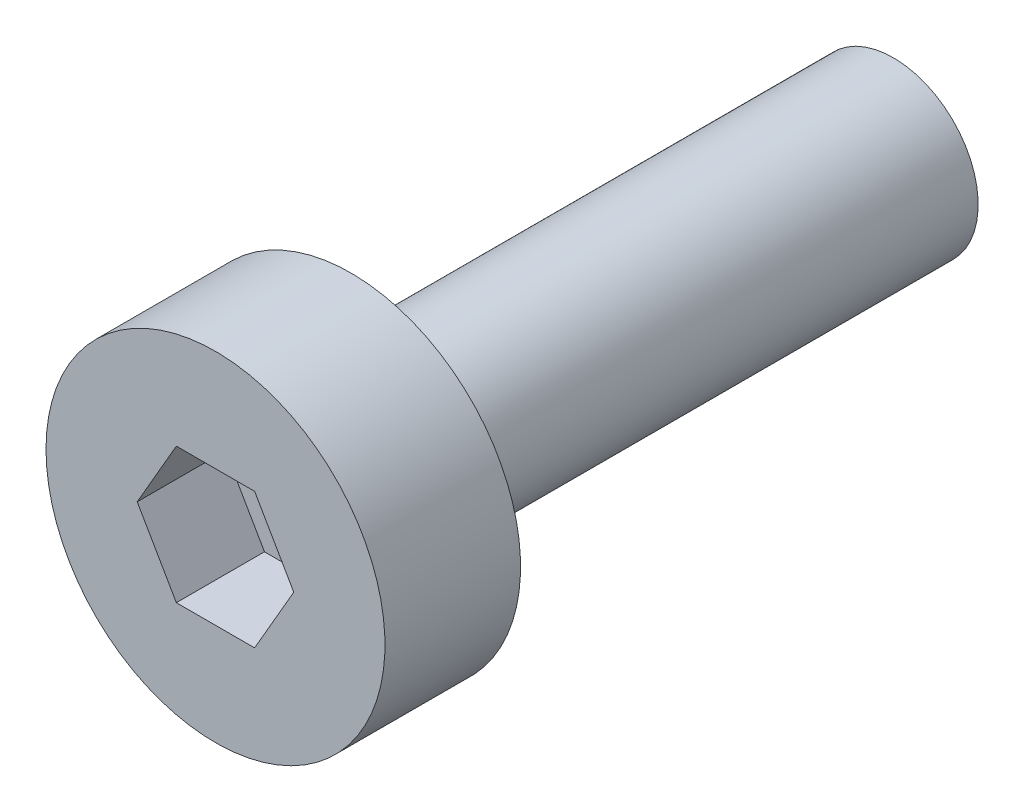
ISO-10303-21;
HEADER;
FILE_DESCRIPTION(('STEP AP214'),'2;1');
FILE_NAME('part.step','',(''),(''),'','','');
FILE_SCHEMA(('AUTOMOTIVE_DESIGN { 1 0 10303 214 1 1 1 1 }'));
ENDSEC;
DATA;
#1=APPLICATION_CONTEXT('core data for automotive mechanical design processes');
#2=APPLICATION_PROTOCOL_DEFINITION('international standard','automotive_design',2000,#1);
#3=PRODUCT_CONTEXT('',#1,'mechanical');
#4=PRODUCT('Part','Part','',(#3));
#5=PRODUCT_RELATED_PRODUCT_CATEGORY('part','',(#4));
#6=PRODUCT_DEFINITION_FORMATION('','',#4);
#7=PRODUCT_DEFINITION_CONTEXT('part definition',#1,'design');
#8=PRODUCT_DEFINITION('design','',#6,#7);
#9=PRODUCT_DEFINITION_SHAPE('','',#8);
#10=(LENGTH_UNIT() NAMED_UNIT(*) SI_UNIT(.MILLI.,.METRE.));
#11=(NAMED_UNIT(*) PLANE_ANGLE_UNIT() SI_UNIT($,.RADIAN.));
#12=(NAMED_UNIT(*) SI_UNIT($,.STERADIAN.) SOLID_ANGLE_UNIT());
#13=UNCERTAINTY_MEASURE_WITH_UNIT(LENGTH_MEASURE(1.E-05),#10,'distance_accuracy_value','');
#14=(GEOMETRIC_REPRESENTATION_CONTEXT(3) GLOBAL_UNCERTAINTY_ASSIGNED_CONTEXT((#13)) GLOBAL_UNIT_ASSIGNED_CONTEXT((#10,
#11,#12)) REPRESENTATION_CONTEXT('',''));
#15=CARTESIAN_POINT('',(0.,0.,0.));
#16=DIRECTION('',(0.,0.,1.));
#17=DIRECTION('',(1.,0.,0.));
#18=AXIS2_PLACEMENT_3D('',#15,#16,#17);
#19=CARTESIAN_POINT('',(0.,0.,0.7));
#20=DIRECTION('',(0.,0.,1.));
#21=DIRECTION('',(1.,0.,0.));
#22=AXIS2_PLACEMENT_3D('',#19,#20,#21);
#23=PLANE('',#22);
#24=DIRECTION('',(-0.50000000000019,0.866025403784329,0.));
#25=VECTOR('',#24,1.);
#26=CARTESIAN_POINT('',(1.154700538379,0.,0.7));
#27=LINE('',#26,#25);
#28=CARTESIAN_POINT('',(1.154700538379,0.,0.7));
#29=VERTEX_POINT('',#28);
#30=CARTESIAN_POINT('',(0.57735026919,1.,0.7));
#31=VERTEX_POINT('',#30);
#32=EDGE_CURVE('E9',#29,#31,#27,.T.);
#33=ORIENTED_EDGE('',*,*,#32,.T.);
#34=DIRECTION('',(-1.,0.,0.));
#35=VECTOR('',#34,1.);
#36=CARTESIAN_POINT('',(0.57735026919,1.,0.7));
#37=LINE('',#36,#35);
#38=CARTESIAN_POINT('',(-0.57735026919,1.,0.7));
#39=VERTEX_POINT('',#38);
#40=EDGE_CURVE('E148',#31,#39,#37,.T.);
#41=ORIENTED_EDGE('',*,*,#40,.T.);
#42=DIRECTION('',(-0.50000000000019,-0.866025403784329,0.));
#43=VECTOR('',#42,1.);
#44=CARTESIAN_POINT('',(-0.57735026919,1.,0.7));
#45=LINE('',#44,#43);
#46=CARTESIAN_POINT('',(-1.154700538379,0.,0.7));
#47=VERTEX_POINT('',#46);
#48=EDGE_CURVE('E157',#39,#47,#45,.T.);
#49=ORIENTED_EDGE('',*,*,#48,.T.);
#50=DIRECTION('',(0.50000000000019,-0.866025403784329,0.));
#51=VECTOR('',#50,1.);
#52=CARTESIAN_POINT('',(-1.154700538379,0.,0.7));
#53=LINE('',#52,#51);
#54=CARTESIAN_POINT('',(-0.57735026919,-1.,0.7));
#55=VERTEX_POINT('',#54);
#56=EDGE_CURVE('E158',#47,#55,#53,.T.);
#57=ORIENTED_EDGE('',*,*,#56,.T.);
#58=DIRECTION('',(1.,0.,0.));
#59=VECTOR('',#58,1.);
#60=CARTESIAN_POINT('',(-0.57735026919,-1.,0.7));
#61=LINE('',#60,#59);
#62=CARTESIAN_POINT('',(0.57735026919,-1.,0.7));
#63=VERTEX_POINT('',#62);
#64=EDGE_CURVE('E149',#55,#63,#61,.T.);
#65=ORIENTED_EDGE('',*,*,#64,.T.);
#66=DIRECTION('',(0.50000000000019,0.866025403784329,0.));
#67=VECTOR('',#66,1.);
#68=CARTESIAN_POINT('',(0.57735026919,-1.,0.7));
#69=LINE('',#68,#67);
#70=EDGE_CURVE('E121',#63,#29,#69,.T.);
#71=ORIENTED_EDGE('',*,*,#70,.T.);
#72=EDGE_LOOP('',(#33,#41,#49,#57,#65,#71));
#73=FACE_BOUND('',#72,.T.);
#74=ADVANCED_FACE('F14',(#73),#23,.T.);
#75=CARTESIAN_POINT('',(0.,0.,-8.));
#76=DIRECTION('',(0.,0.,-1.));
#77=DIRECTION('',(0.,-1.,0.));
#78=AXIS2_PLACEMENT_3D('',#75,#76,#77);
#79=PLANE('',#78);
#80=CARTESIAN_POINT('',(0.,0.,-8.));
#81=DIRECTION('',(0.,0.,-1.));
#82=DIRECTION('',(-1.,0.,0.));
#83=AXIS2_PLACEMENT_3D('',#80,#81,#82);
#84=CIRCLE('',#83,1.25);
#85=CARTESIAN_POINT('',(-1.25,0.,-8.));
#86=VERTEX_POINT('',#85);
#87=EDGE_CURVE('E119',#86,#86,#84,.T.);
#88=ORIENTED_EDGE('',*,*,#87,.T.);
#89=EDGE_LOOP('',(#88));
#90=FACE_BOUND('',#89,.T.);
#91=ADVANCED_FACE('F232',(#90),#79,.T.);
#92=CARTESIAN_POINT('',(1.154700538379,0.,0.7));
#93=DIRECTION('',(-0.866025403784329,-0.50000000000019,0.));
#94=DIRECTION('',(-0.50000000000019,0.866025403784329,0.));
#95=AXIS2_PLACEMENT_3D('',#92,#93,#94);
#96=PLANE('',#95);
#97=ORIENTED_EDGE('',*,*,#32,.F.);
#98=DIRECTION('',(0.,0.,1.));
#99=VECTOR('',#98,1.);
#100=CARTESIAN_POINT('',(1.154700538379,0.,0.7));
#101=LINE('',#100,#99);
#102=CARTESIAN_POINT('',(1.154700538379,0.,2.));
#103=VERTEX_POINT('',#102);
#104=EDGE_CURVE('E145',#29,#103,#101,.T.);
#105=ORIENTED_EDGE('',*,*,#104,.T.);
#106=DIRECTION('',(-0.50000000000019,0.866025403784329,0.));
#107=VECTOR('',#106,1.);
#108=CARTESIAN_POINT('',(1.010362971082,0.25,2.));
#109=LINE('',#108,#107);
#110=CARTESIAN_POINT('',(0.57735026919,1.,2.));
#111=VERTEX_POINT('',#110);
#112=EDGE_CURVE('E138',#103,#111,#109,.T.);
#113=ORIENTED_EDGE('',*,*,#112,.T.);
#114=DIRECTION('',(0.,0.,1.));
#115=VECTOR('',#114,1.);
#116=CARTESIAN_POINT('',(0.57735026919,1.,0.7));
#117=LINE('',#116,#115);
#118=EDGE_CURVE('E25',#31,#111,#117,.T.);
#119=ORIENTED_EDGE('',*,*,#118,.F.);
#120=EDGE_LOOP('',(#97,#105,#113,#119));
#121=FACE_BOUND('',#120,.T.);
#122=ADVANCED_FACE('F202',(#121),#96,.T.);
#123=CARTESIAN_POINT('',(0.57735026919,1.,0.7));
#124=DIRECTION('',(0.,-1.,0.));
#125=DIRECTION('',(-1.,0.,0.));
#126=AXIS2_PLACEMENT_3D('',#123,#124,#125);
#127=PLANE('',#126);
#128=ORIENTED_EDGE('',*,*,#40,.F.);
#129=ORIENTED_EDGE('',*,*,#118,.T.);
#130=DIRECTION('',(-1.,0.,0.));
#131=VECTOR('',#130,1.);
#132=CARTESIAN_POINT('',(0.288675134595,1.,2.));
#133=LINE('',#132,#131);
#134=CARTESIAN_POINT('',(-0.57735026919,1.,2.));
#135=VERTEX_POINT('',#134);
#136=EDGE_CURVE('E136',#111,#135,#133,.T.);
#137=ORIENTED_EDGE('',*,*,#136,.T.);
#138=DIRECTION('',(0.,0.,1.));
#139=VECTOR('',#138,1.);
#140=CARTESIAN_POINT('',(-0.57735026919,1.,0.7));
#141=LINE('',#140,#139);
#142=EDGE_CURVE('E62',#39,#135,#141,.T.);
#143=ORIENTED_EDGE('',*,*,#142,.F.);
#144=EDGE_LOOP('',(#128,#129,#137,#143));
#145=FACE_BOUND('',#144,.T.);
#146=ADVANCED_FACE('F204',(#145),#127,.T.);
#147=CARTESIAN_POINT('',(-0.57735026919,1.,0.7));
#148=DIRECTION('',(0.866025403784329,-0.50000000000019,0.));
#149=DIRECTION('',(0.,0.,-1.));
#150=AXIS2_PLACEMENT_3D('',#147,#148,#149);
#151=PLANE('',#150);
#152=ORIENTED_EDGE('',*,*,#48,.F.);
#153=ORIENTED_EDGE('',*,*,#142,.T.);
#154=DIRECTION('',(-0.50000000000019,-0.866025403784329,0.));
#155=VECTOR('',#154,1.);
#156=CARTESIAN_POINT('',(-0.721687836487,0.75,2.));
#157=LINE('',#156,#155);
#158=CARTESIAN_POINT('',(-1.154700538379,0.,2.));
#159=VERTEX_POINT('',#158);
#160=EDGE_CURVE('E139',#135,#159,#157,.T.);
#161=ORIENTED_EDGE('',*,*,#160,.T.);
#162=DIRECTION('',(0.,0.,1.));
#163=VECTOR('',#162,1.);
#164=CARTESIAN_POINT('',(-1.154700538379,0.,0.7));
#165=LINE('',#164,#163);
#166=EDGE_CURVE('E73',#47,#159,#165,.T.);
#167=ORIENTED_EDGE('',*,*,#166,.F.);
#168=EDGE_LOOP('',(#152,#153,#161,#167));
#169=FACE_BOUND('',#168,.T.);
#170=ADVANCED_FACE('F206',(#169),#151,.T.);
#171=CARTESIAN_POINT('',(-1.154700538379,0.,0.7));
#172=DIRECTION('',(0.866025403784329,0.50000000000019,0.));
#173=DIRECTION('',(0.,0.,-1.));
#174=AXIS2_PLACEMENT_3D('',#171,#172,#173);
#175=PLANE('',#174);
#176=ORIENTED_EDGE('',*,*,#56,.F.);
#177=ORIENTED_EDGE('',*,*,#166,.T.);
#178=DIRECTION('',(0.50000000000019,-0.866025403784329,0.));
#179=VECTOR('',#178,1.);
#180=CARTESIAN_POINT('',(-1.010362971082,-0.25,2.));
#181=LINE('',#180,#179);
#182=CARTESIAN_POINT('',(-0.57735026919,-1.,2.));
#183=VERTEX_POINT('',#182);
#184=EDGE_CURVE('E18',#159,#183,#181,.T.);
#185=ORIENTED_EDGE('',*,*,#184,.T.);
#186=DIRECTION('',(0.,0.,1.));
#187=VECTOR('',#186,1.);
#188=CARTESIAN_POINT('',(-0.57735026919,-1.,0.7));
#189=LINE('',#188,#187);
#190=EDGE_CURVE('E152',#55,#183,#189,.T.);
#191=ORIENTED_EDGE('',*,*,#190,.F.);
#192=EDGE_LOOP('',(#176,#177,#185,#191));
#193=FACE_BOUND('',#192,.T.);
#194=ADVANCED_FACE('F193',(#193),#175,.T.);
#195=CARTESIAN_POINT('',(-0.57735026919,-1.,0.7));
#196=DIRECTION('',(0.,1.,0.));
#197=DIRECTION('',(1.,0.,0.));
#198=AXIS2_PLACEMENT_3D('',#195,#196,#197);
#199=PLANE('',#198);
#200=ORIENTED_EDGE('',*,*,#64,.F.);
#201=ORIENTED_EDGE('',*,*,#190,.T.);
#202=DIRECTION('',(1.,0.,0.));
#203=VECTOR('',#202,1.);
#204=CARTESIAN_POINT('',(-0.288675134595,-1.,2.));
#205=LINE('',#204,#203);
#206=CARTESIAN_POINT('',(0.57735026919,-1.,2.));
#207=VERTEX_POINT('',#206);
#208=EDGE_CURVE('E160',#183,#207,#205,.T.);
#209=ORIENTED_EDGE('',*,*,#208,.T.);
#210=DIRECTION('',(0.,0.,1.));
#211=VECTOR('',#210,1.);
#212=CARTESIAN_POINT('',(0.57735026919,-1.,0.7));
#213=LINE('',#212,#211);
#214=EDGE_CURVE('E127',#63,#207,#213,.T.);
#215=ORIENTED_EDGE('',*,*,#214,.F.);
#216=EDGE_LOOP('',(#200,#201,#209,#215));
#217=FACE_BOUND('',#216,.T.);
#218=ADVANCED_FACE('F195',(#217),#199,.T.);
#219=CARTESIAN_POINT('',(0.57735026919,-1.,0.7));
#220=DIRECTION('',(-0.866025403784329,0.50000000000019,0.));
#221=DIRECTION('',(0.,0.,1.));
#222=AXIS2_PLACEMENT_3D('',#219,#220,#221);
#223=PLANE('',#222);
#224=ORIENTED_EDGE('',*,*,#70,.F.);
#225=ORIENTED_EDGE('',*,*,#214,.T.);
#226=DIRECTION('',(0.50000000000019,0.866025403784329,0.));
#227=VECTOR('',#226,1.);
#228=CARTESIAN_POINT('',(0.721687836487,-0.75,2.));
#229=LINE('',#228,#227);
#230=EDGE_CURVE('E130',#207,#103,#229,.T.);
#231=ORIENTED_EDGE('',*,*,#230,.T.);
#232=ORIENTED_EDGE('',*,*,#104,.F.);
#233=EDGE_LOOP('',(#224,#225,#231,#232));
#234=FACE_BOUND('',#233,.T.);
#235=ADVANCED_FACE('F16',(#234),#223,.T.);
#236=CARTESIAN_POINT('',(0.,0.,0.));
#237=DIRECTION('',(0.,0.,-1.));
#238=DIRECTION('',(-1.,0.,0.));
#239=AXIS2_PLACEMENT_3D('',#236,#237,#238);
#240=CYLINDRICAL_SURFACE('',#239,1.25);
#241=ORIENTED_EDGE('',*,*,#87,.F.);
#242=DIRECTION('',(0.,0.,-1.));
#243=VECTOR('',#242,1.);
#244=CARTESIAN_POINT('',(-1.25,0.,0.));
#245=LINE('',#244,#243);
#246=CARTESIAN_POINT('',(-1.25,0.,0.));
#247=VERTEX_POINT('',#246);
#248=EDGE_CURVE('E114',#247,#86,#245,.T.);
#249=ORIENTED_EDGE('',*,*,#248,.F.);
#250=CARTESIAN_POINT('',(0.,0.,0.));
#251=DIRECTION('',(0.,0.,-1.));
#252=DIRECTION('',(-1.,0.,0.));
#253=AXIS2_PLACEMENT_3D('',#250,#251,#252);
#254=CIRCLE('',#253,1.25);
#255=EDGE_CURVE('E117',#247,#247,#254,.T.);
#256=ORIENTED_EDGE('',*,*,#255,.T.);
#257=ORIENTED_EDGE('',*,*,#248,.T.);
#258=EDGE_LOOP('',(#241,#249,#256,#257));
#259=FACE_BOUND('',#258,.T.);
#260=ADVANCED_FACE('F115',(#259),#240,.T.);
#261=CARTESIAN_POINT('',(0.,0.,2.));
#262=DIRECTION('',(0.,0.,-1.));
#263=DIRECTION('',(0.,-1.,0.));
#264=AXIS2_PLACEMENT_3D('',#261,#262,#263);
#265=PLANE('',#264);
#266=ORIENTED_EDGE('',*,*,#208,.F.);
#267=ORIENTED_EDGE('',*,*,#184,.F.);
#268=ORIENTED_EDGE('',*,*,#160,.F.);
#269=ORIENTED_EDGE('',*,*,#136,.F.);
#270=ORIENTED_EDGE('',*,*,#112,.F.);
#271=ORIENTED_EDGE('',*,*,#230,.F.);
#272=EDGE_LOOP('',(#266,#267,#268,#269,#270,#271));
#273=FACE_BOUND('',#272,.T.);
#274=CARTESIAN_POINT('',(0.,0.,2.));
#275=DIRECTION('',(0.,0.,-1.));
#276=DIRECTION('',(-1.,0.,0.));
#277=AXIS2_PLACEMENT_3D('',#274,#275,#276);
#278=CIRCLE('',#277,2.5);
#279=CARTESIAN_POINT('',(-2.5,0.,2.));
#280=VERTEX_POINT('',#279);
#281=EDGE_CURVE('E169',#280,#280,#278,.T.);
#282=ORIENTED_EDGE('',*,*,#281,.F.);
#283=EDGE_LOOP('',(#282));
#284=FACE_BOUND('',#283,.T.);
#285=ADVANCED_FACE('F208',(#273,#284),#265,.F.);
#286=CARTESIAN_POINT('',(0.,0.,0.));
#287=DIRECTION('',(0.,0.,-1.));
#288=DIRECTION('',(0.,-1.,0.));
#289=AXIS2_PLACEMENT_3D('',#286,#287,#288);
#290=PLANE('',#289);
#291=ORIENTED_EDGE('',*,*,#255,.F.);
#292=EDGE_LOOP('',(#291));
#293=FACE_BOUND('',#292,.T.);
#294=CARTESIAN_POINT('',(0.,0.,0.));
#295=DIRECTION('',(0.,0.,-1.));
#296=DIRECTION('',(-1.,0.,0.));
#297=AXIS2_PLACEMENT_3D('',#294,#295,#296);
#298=CIRCLE('',#297,2.5);
#299=CARTESIAN_POINT('',(-2.5,0.,0.));
#300=VERTEX_POINT('',#299);
#301=EDGE_CURVE('E184',#300,#300,#298,.T.);
#302=ORIENTED_EDGE('',*,*,#301,.T.);
#303=EDGE_LOOP('',(#302));
#304=FACE_BOUND('',#303,.T.);
#305=ADVANCED_FACE('F211',(#293,#304),#290,.T.);
#306=CARTESIAN_POINT('',(0.,0.,2.));
#307=DIRECTION('',(0.,0.,-1.));
#308=DIRECTION('',(-1.,0.,0.));
#309=AXIS2_PLACEMENT_3D('',#306,#307,#308);
#310=CYLINDRICAL_SURFACE('',#309,2.5);
#311=ORIENTED_EDGE('',*,*,#301,.F.);
#312=DIRECTION('',(0.,0.,-1.));
#313=VECTOR('',#312,1.);
#314=CARTESIAN_POINT('',(-2.5,0.,2.));
#315=LINE('',#314,#313);
#316=EDGE_CURVE('E134',#280,#300,#315,.T.);
#317=ORIENTED_EDGE('',*,*,#316,.F.);
#318=ORIENTED_EDGE('',*,*,#281,.T.);
#319=ORIENTED_EDGE('',*,*,#316,.T.);
#320=EDGE_LOOP('',(#311,#317,#318,#319));
#321=FACE_BOUND('',#320,.T.);
#322=ADVANCED_FACE('F217',(#321),#310,.T.);
#323=CLOSED_SHELL('',(#74,#91,#122,#146,#170,#194,#218,#235,#260,#285,#305,#322));
#324=MANIFOLD_SOLID_BREP('B1',#323);
#325=ADVANCED_BREP_SHAPE_REPRESENTATION('',(#18,#324),#14);
#326=SHAPE_DEFINITION_REPRESENTATION(#9,#325);
ENDSEC;
END-ISO-10303-21;
